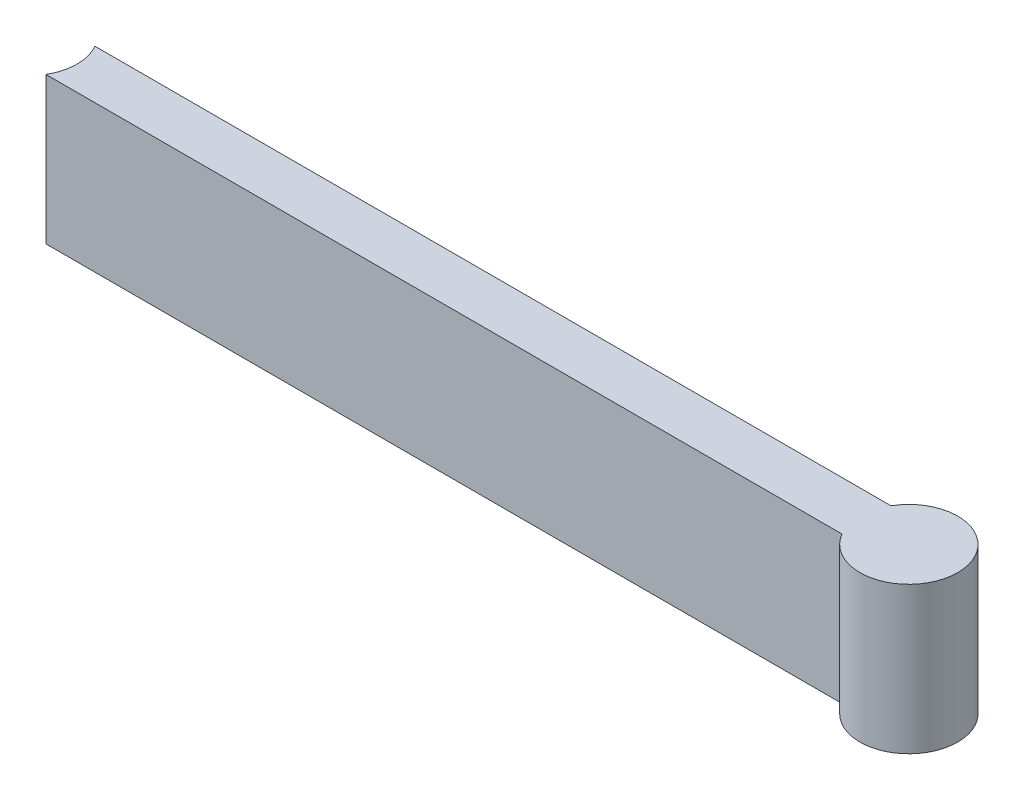
ISO-10303-21;
HEADER;
FILE_DESCRIPTION(('STEP AP214'),'2;1');
FILE_NAME('part.step','',(''),(''),'','','');
FILE_SCHEMA(('AUTOMOTIVE_DESIGN { 1 0 10303 214 1 1 1 1 }'));
ENDSEC;
DATA;
#1=APPLICATION_CONTEXT('core data for automotive mechanical design processes');
#2=APPLICATION_PROTOCOL_DEFINITION('international standard','automotive_design',2000,#1);
#3=PRODUCT_CONTEXT('',#1,'mechanical');
#4=PRODUCT('Part','Part','',(#3));
#5=PRODUCT_RELATED_PRODUCT_CATEGORY('part','',(#4));
#6=PRODUCT_DEFINITION_FORMATION('','',#4);
#7=PRODUCT_DEFINITION_CONTEXT('part definition',#1,'design');
#8=PRODUCT_DEFINITION('design','',#6,#7);
#9=PRODUCT_DEFINITION_SHAPE('','',#8);
#10=(LENGTH_UNIT() NAMED_UNIT(*) SI_UNIT(.MILLI.,.METRE.));
#11=(NAMED_UNIT(*) PLANE_ANGLE_UNIT() SI_UNIT($,.RADIAN.));
#12=(NAMED_UNIT(*) SI_UNIT($,.STERADIAN.) SOLID_ANGLE_UNIT());
#13=UNCERTAINTY_MEASURE_WITH_UNIT(LENGTH_MEASURE(1.E-05),#10,'distance_accuracy_value','');
#14=(GEOMETRIC_REPRESENTATION_CONTEXT(3) GLOBAL_UNCERTAINTY_ASSIGNED_CONTEXT((#13)) GLOBAL_UNIT_ASSIGNED_CONTEXT((#10,
#11,#12)) REPRESENTATION_CONTEXT('',''));
#15=CARTESIAN_POINT('',(0.,0.,0.));
#16=DIRECTION('',(0.,0.,1.));
#17=DIRECTION('',(1.,0.,0.));
#18=AXIS2_PLACEMENT_3D('',#15,#16,#17);
#19=CARTESIAN_POINT('',(0.,987.196572368301,0.));
#20=DIRECTION('',(0.,-1.,0.));
#21=DIRECTION('',(0.,0.,-1.));
#22=AXIS2_PLACEMENT_3D('',#19,#20,#21);
#23=CYLINDRICAL_SURFACE('',#22,50.);
#24=CARTESIAN_POINT('',(0.,75.,0.));
#25=DIRECTION('',(0.,1.,0.));
#26=DIRECTION('',(0.,0.,1.));
#27=AXIS2_PLACEMENT_3D('',#24,#25,#26);
#28=CIRCLE('',#27,50.);
#29=CARTESIAN_POINT('',(43.3012701892219,74.9999999999998,-25.));
#30=VERTEX_POINT('',#29);
#31=CARTESIAN_POINT('',(43.3012701892219,74.9999999999997,25.));
#32=VERTEX_POINT('',#31);
#33=EDGE_CURVE('E99',#30,#32,#28,.F.);
#34=ORIENTED_EDGE('',*,*,#33,.F.);
#35=DIRECTION('',(0.,-1.,0.));
#36=VECTOR('',#35,1.);
#37=CARTESIAN_POINT('',(43.3012701892219,987.196572368301,-25.));
#38=LINE('',#37,#36);
#39=CARTESIAN_POINT('',(43.3012701892219,-75.0000000000001,-25.));
#40=VERTEX_POINT('',#39);
#41=EDGE_CURVE('E37',#30,#40,#38,.T.);
#42=ORIENTED_EDGE('',*,*,#41,.T.);
#43=CARTESIAN_POINT('',(0.,-75.,0.));
#44=DIRECTION('',(0.,1.,0.));
#45=DIRECTION('',(0.,0.,1.));
#46=AXIS2_PLACEMENT_3D('',#43,#44,#45);
#47=CIRCLE('',#46,50.);
#48=CARTESIAN_POINT('',(43.3012701892219,-75.,25.));
#49=VERTEX_POINT('',#48);
#50=EDGE_CURVE('E93',#49,#40,#47,.T.);
#51=ORIENTED_EDGE('',*,*,#50,.F.);
#52=DIRECTION('',(0.,-1.,0.));
#53=VECTOR('',#52,1.);
#54=CARTESIAN_POINT('',(43.3012701892219,987.196572368301,25.));
#55=LINE('',#54,#53);
#56=EDGE_CURVE('E82',#32,#49,#55,.T.);
#57=ORIENTED_EDGE('',*,*,#56,.F.);
#58=EDGE_LOOP('',(#34,#42,#51,#57));
#59=FACE_BOUND('',#58,.T.);
#60=ADVANCED_FACE('F33',(#59),#23,.F.);
#61=CARTESIAN_POINT('',(43.3012701892219,987.196572368301,25.));
#62=DIRECTION('',(0.,0.,-1.));
#63=DIRECTION('',(-1.,0.,0.));
#64=AXIS2_PLACEMENT_3D('',#61,#62,#63);
#65=PLANE('',#64);
#66=DIRECTION('',(1.,0.,0.));
#67=VECTOR('',#66,1.);
#68=CARTESIAN_POINT('',(43.3012701892213,75.,25.));
#69=LINE('',#68,#67);
#70=CARTESIAN_POINT('',(856.698729810778,74.9999999999993,25.));
#71=VERTEX_POINT('',#70);
#72=EDGE_CURVE('E42',#32,#71,#69,.T.);
#73=ORIENTED_EDGE('',*,*,#72,.F.);
#74=ORIENTED_EDGE('',*,*,#56,.T.);
#75=DIRECTION('',(-1.,0.,0.));
#76=VECTOR('',#75,1.);
#77=CARTESIAN_POINT('',(43.3012701892225,-75.,25.));
#78=LINE('',#77,#76);
#79=CARTESIAN_POINT('',(856.698729810778,-75.0000000000002,25.));
#80=VERTEX_POINT('',#79);
#81=EDGE_CURVE('E88',#80,#49,#78,.T.);
#82=ORIENTED_EDGE('',*,*,#81,.F.);
#83=DIRECTION('',(0.,-1.,0.));
#84=VECTOR('',#83,1.);
#85=CARTESIAN_POINT('',(856.698729810778,987.196572368301,25.));
#86=LINE('',#85,#84);
#87=EDGE_CURVE('E77',#71,#80,#86,.T.);
#88=ORIENTED_EDGE('',*,*,#87,.F.);
#89=EDGE_LOOP('',(#73,#74,#82,#88));
#90=FACE_BOUND('',#89,.T.);
#91=ADVANCED_FACE('F92',(#90),#65,.F.);
#92=CARTESIAN_POINT('',(900.,987.196572368301,0.));
#93=DIRECTION('',(0.,-1.,0.));
#94=DIRECTION('',(0.,0.,-1.));
#95=AXIS2_PLACEMENT_3D('',#92,#93,#94);
#96=CYLINDRICAL_SURFACE('',#95,50.);
#97=CARTESIAN_POINT('',(900.,74.9999999999993,0.));
#98=DIRECTION('',(0.,1.,0.));
#99=DIRECTION('',(0.,0.,1.));
#100=AXIS2_PLACEMENT_3D('',#97,#98,#99);
#101=CIRCLE('',#100,50.);
#102=CARTESIAN_POINT('',(856.698729810778,74.9999999999995,-25.));
#103=VERTEX_POINT('',#102);
#104=EDGE_CURVE('E11',#71,#103,#101,.T.);
#105=ORIENTED_EDGE('',*,*,#104,.F.);
#106=ORIENTED_EDGE('',*,*,#87,.T.);
#107=CARTESIAN_POINT('',(900.,-75.0000000000006,0.));
#108=DIRECTION('',(0.,1.,0.));
#109=DIRECTION('',(0.,0.,1.));
#110=AXIS2_PLACEMENT_3D('',#107,#108,#109);
#111=CIRCLE('',#110,50.);
#112=CARTESIAN_POINT('',(856.698729810778,-75.0000000000006,-25.));
#113=VERTEX_POINT('',#112);
#114=EDGE_CURVE('E80',#113,#80,#111,.F.);
#115=ORIENTED_EDGE('',*,*,#114,.F.);
#116=DIRECTION('',(0.,-1.,0.));
#117=VECTOR('',#116,1.);
#118=CARTESIAN_POINT('',(856.698729810778,987.196572368301,-25.));
#119=LINE('',#118,#117);
#120=EDGE_CURVE('E58',#103,#113,#119,.T.);
#121=ORIENTED_EDGE('',*,*,#120,.F.);
#122=EDGE_LOOP('',(#105,#106,#115,#121));
#123=FACE_BOUND('',#122,.T.);
#124=ADVANCED_FACE('F79',(#123),#96,.T.);
#125=CARTESIAN_POINT('',(43.3012701892219,987.196572368301,-25.));
#126=DIRECTION('',(0.,0.,1.));
#127=DIRECTION('',(1.,0.,0.));
#128=AXIS2_PLACEMENT_3D('',#125,#126,#127);
#129=PLANE('',#128);
#130=DIRECTION('',(-1.,0.,0.));
#131=VECTOR('',#130,1.);
#132=CARTESIAN_POINT('',(43.3012701892213,74.9999999999998,-25.));
#133=LINE('',#132,#131);
#134=EDGE_CURVE('E102',#103,#30,#133,.T.);
#135=ORIENTED_EDGE('',*,*,#134,.F.);
#136=ORIENTED_EDGE('',*,*,#120,.T.);
#137=DIRECTION('',(1.,0.,0.));
#138=VECTOR('',#137,1.);
#139=CARTESIAN_POINT('',(43.3012701892225,-75.0000000000001,-25.));
#140=LINE('',#139,#138);
#141=EDGE_CURVE('E90',#40,#113,#140,.T.);
#142=ORIENTED_EDGE('',*,*,#141,.F.);
#143=ORIENTED_EDGE('',*,*,#41,.F.);
#144=EDGE_LOOP('',(#135,#136,#142,#143));
#145=FACE_BOUND('',#144,.T.);
#146=ADVANCED_FACE('F106',(#145),#129,.F.);
#147=CARTESIAN_POINT('',(-679.718959026592,75.0000000000006,167.278620091802));
#148=DIRECTION('',(0.,1.,0.));
#149=DIRECTION('',(0.987494987952688,0.,-0.157650400469902));
#150=AXIS2_PLACEMENT_3D('',#147,#148,#149);
#151=PLANE('',#150);
#152=ORIENTED_EDGE('',*,*,#134,.T.);
#153=ORIENTED_EDGE('',*,*,#33,.T.);
#154=ORIENTED_EDGE('',*,*,#72,.T.);
#155=ORIENTED_EDGE('',*,*,#104,.T.);
#156=EDGE_LOOP('',(#152,#153,#154,#155));
#157=FACE_BOUND('',#156,.T.);
#158=ADVANCED_FACE('F35',(#157),#151,.T.);
#159=CARTESIAN_POINT('',(-679.718959026592,-74.9999999999994,167.278620091803));
#160=DIRECTION('',(0.,1.,0.));
#161=DIRECTION('',(0.987494987952688,0.,-0.157650400469902));
#162=AXIS2_PLACEMENT_3D('',#159,#160,#161);
#163=PLANE('',#162);
#164=ORIENTED_EDGE('',*,*,#50,.T.);
#165=ORIENTED_EDGE('',*,*,#141,.T.);
#166=ORIENTED_EDGE('',*,*,#114,.T.);
#167=ORIENTED_EDGE('',*,*,#81,.T.);
#168=EDGE_LOOP('',(#164,#165,#166,#167));
#169=FACE_BOUND('',#168,.T.);
#170=ADVANCED_FACE('F87',(#169),#163,.F.);
#171=CLOSED_SHELL('',(#60,#91,#124,#146,#158,#170));
#172=MANIFOLD_SOLID_BREP('B2',#171);
#173=ADVANCED_BREP_SHAPE_REPRESENTATION('',(#18,#172),#14);
#174=SHAPE_DEFINITION_REPRESENTATION(#9,#173);
ENDSEC;
END-ISO-10303-21;
